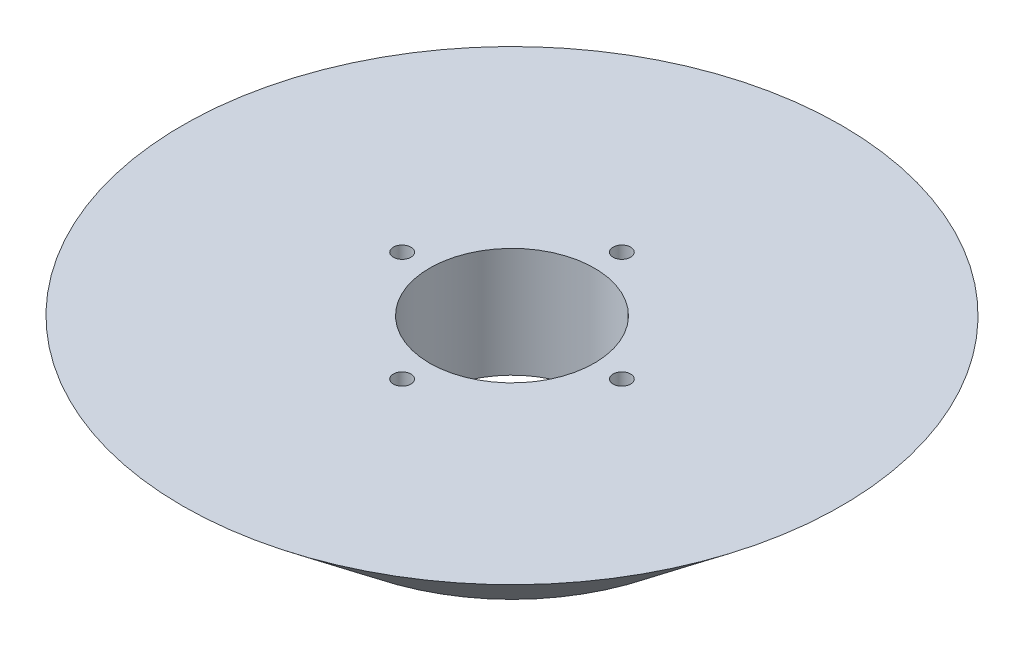
ISO-10303-21;
HEADER;
FILE_DESCRIPTION(('STEP AP214'),'2;1');
FILE_NAME('part.step','',(''),(''),'','','');
FILE_SCHEMA(('AUTOMOTIVE_DESIGN { 1 0 10303 214 1 1 1 1 }'));
ENDSEC;
DATA;
#1=APPLICATION_CONTEXT('core data for automotive mechanical design processes');
#2=APPLICATION_PROTOCOL_DEFINITION('international standard','automotive_design',2000,#1);
#3=PRODUCT_CONTEXT('',#1,'mechanical');
#4=PRODUCT('Part','Part','',(#3));
#5=PRODUCT_RELATED_PRODUCT_CATEGORY('part','',(#4));
#6=PRODUCT_DEFINITION_FORMATION('','',#4);
#7=PRODUCT_DEFINITION_CONTEXT('part definition',#1,'design');
#8=PRODUCT_DEFINITION('design','',#6,#7);
#9=PRODUCT_DEFINITION_SHAPE('','',#8);
#10=(LENGTH_UNIT() NAMED_UNIT(*) SI_UNIT(.MILLI.,.METRE.));
#11=(NAMED_UNIT(*) PLANE_ANGLE_UNIT() SI_UNIT($,.RADIAN.));
#12=(NAMED_UNIT(*) SI_UNIT($,.STERADIAN.) SOLID_ANGLE_UNIT());
#13=UNCERTAINTY_MEASURE_WITH_UNIT(LENGTH_MEASURE(1.E-05),#10,'distance_accuracy_value','');
#14=(GEOMETRIC_REPRESENTATION_CONTEXT(3) GLOBAL_UNCERTAINTY_ASSIGNED_CONTEXT((#13)) GLOBAL_UNIT_ASSIGNED_CONTEXT((#10,
#11,#12)) REPRESENTATION_CONTEXT('',''));
#15=CARTESIAN_POINT('',(0.,0.,0.));
#16=DIRECTION('',(0.,0.,1.));
#17=DIRECTION('',(1.,0.,0.));
#18=AXIS2_PLACEMENT_3D('',#15,#16,#17);
#19=CARTESIAN_POINT('',(0.,0.,0.));
#20=DIRECTION('',(0.,1.,0.));
#21=DIRECTION('',(0.,0.,1.));
#22=AXIS2_PLACEMENT_3D('',#19,#20,#21);
#23=PLANE('',#22);
#24=CARTESIAN_POINT('',(0.,0.,-20.));
#25=DIRECTION('',(0.,1.,0.));
#26=DIRECTION('',(0.,0.,1.));
#27=AXIS2_PLACEMENT_3D('',#24,#25,#26);
#28=CIRCLE('',#27,1.6);
#29=CARTESIAN_POINT('',(0.,0.,-18.4));
#30=VERTEX_POINT('',#29);
#31=EDGE_CURVE('E46',#30,#30,#28,.T.);
#32=ORIENTED_EDGE('',*,*,#31,.T.);
#33=EDGE_LOOP('',(#32));
#34=FACE_BOUND('',#33,.T.);
#35=CARTESIAN_POINT('',(-20.,0.,0.));
#36=DIRECTION('',(0.,1.,0.));
#37=DIRECTION('',(0.,0.,1.));
#38=AXIS2_PLACEMENT_3D('',#35,#36,#37);
#39=CIRCLE('',#38,1.6000000000002);
#40=CARTESIAN_POINT('',(-20.,0.,1.6000000000002));
#41=VERTEX_POINT('',#40);
#42=EDGE_CURVE('E104',#41,#41,#39,.T.);
#43=ORIENTED_EDGE('',*,*,#42,.T.);
#44=EDGE_LOOP('',(#43));
#45=FACE_BOUND('',#44,.T.);
#46=CARTESIAN_POINT('',(0.,0.,20.));
#47=DIRECTION('',(0.,1.,0.));
#48=DIRECTION('',(0.,0.,1.));
#49=AXIS2_PLACEMENT_3D('',#46,#47,#48);
#50=CIRCLE('',#49,1.60000000000013);
#51=CARTESIAN_POINT('',(0.,0.,21.6000000000001));
#52=VERTEX_POINT('',#51);
#53=EDGE_CURVE('E107',#52,#52,#50,.T.);
#54=ORIENTED_EDGE('',*,*,#53,.T.);
#55=EDGE_LOOP('',(#54));
#56=FACE_BOUND('',#55,.T.);
#57=CARTESIAN_POINT('',(20.,0.,0.));
#58=DIRECTION('',(0.,1.,0.));
#59=DIRECTION('',(0.,0.,1.));
#60=AXIS2_PLACEMENT_3D('',#57,#58,#59);
#61=CIRCLE('',#60,1.60000000000007);
#62=CARTESIAN_POINT('',(20.,0.,1.60000000000007));
#63=VERTEX_POINT('',#62);
#64=EDGE_CURVE('E110',#63,#63,#61,.T.);
#65=ORIENTED_EDGE('',*,*,#64,.T.);
#66=EDGE_LOOP('',(#65));
#67=FACE_BOUND('',#66,.T.);
#68=CARTESIAN_POINT('',(0.,0.,0.));
#69=DIRECTION('',(0.,1.,0.));
#70=DIRECTION('',(0.,0.,1.));
#71=AXIS2_PLACEMENT_3D('',#68,#69,#70);
#72=CIRCLE('',#71,15.);
#73=CARTESIAN_POINT('',(0.,0.,15.));
#74=VERTEX_POINT('',#73);
#75=EDGE_CURVE('E113',#74,#74,#72,.T.);
#76=ORIENTED_EDGE('',*,*,#75,.T.);
#77=EDGE_LOOP('',(#76));
#78=FACE_BOUND('',#77,.T.);
#79=CARTESIAN_POINT('',(0.,0.,0.));
#80=DIRECTION('',(0.,1.,0.));
#81=DIRECTION('',(0.,0.,1.));
#82=AXIS2_PLACEMENT_3D('',#79,#80,#81);
#83=CIRCLE('',#82,35.);
#84=CARTESIAN_POINT('',(0.,0.,35.));
#85=VERTEX_POINT('',#84);
#86=EDGE_CURVE('E11',#85,#85,#83,.T.);
#87=ORIENTED_EDGE('',*,*,#86,.F.);
#88=EDGE_LOOP('',(#87));
#89=FACE_BOUND('',#88,.T.);
#90=ADVANCED_FACE('F33',(#34,#45,#56,#67,#78,#89),#23,.F.);
#91=CARTESIAN_POINT('',(0.,20.,0.));
#92=DIRECTION('',(0.,1.,0.));
#93=DIRECTION('',(0.,0.,1.));
#94=AXIS2_PLACEMENT_3D('',#91,#92,#93);
#95=PLANE('',#94);
#96=CARTESIAN_POINT('',(0.,20.,-20.));
#97=DIRECTION('',(0.,1.,0.));
#98=DIRECTION('',(0.,0.,1.));
#99=AXIS2_PLACEMENT_3D('',#96,#97,#98);
#100=CIRCLE('',#99,1.6);
#101=CARTESIAN_POINT('',(0.,20.,-18.4));
#102=VERTEX_POINT('',#101);
#103=EDGE_CURVE('E116',#102,#102,#100,.T.);
#104=ORIENTED_EDGE('',*,*,#103,.F.);
#105=EDGE_LOOP('',(#104));
#106=FACE_BOUND('',#105,.T.);
#107=CARTESIAN_POINT('',(-20.,20.,0.));
#108=DIRECTION('',(0.,1.,0.));
#109=DIRECTION('',(0.,0.,1.));
#110=AXIS2_PLACEMENT_3D('',#107,#108,#109);
#111=CIRCLE('',#110,1.6000000000002);
#112=CARTESIAN_POINT('',(-20.,20.,1.6000000000002));
#113=VERTEX_POINT('',#112);
#114=EDGE_CURVE('E124',#113,#113,#111,.T.);
#115=ORIENTED_EDGE('',*,*,#114,.F.);
#116=EDGE_LOOP('',(#115));
#117=FACE_BOUND('',#116,.T.);
#118=CARTESIAN_POINT('',(0.,20.,20.));
#119=DIRECTION('',(0.,1.,0.));
#120=DIRECTION('',(0.,0.,1.));
#121=AXIS2_PLACEMENT_3D('',#118,#119,#120);
#122=CIRCLE('',#121,1.60000000000013);
#123=CARTESIAN_POINT('',(0.,20.,21.6000000000001));
#124=VERTEX_POINT('',#123);
#125=EDGE_CURVE('E121',#124,#124,#122,.T.);
#126=ORIENTED_EDGE('',*,*,#125,.F.);
#127=EDGE_LOOP('',(#126));
#128=FACE_BOUND('',#127,.T.);
#129=CARTESIAN_POINT('',(20.,20.,0.));
#130=DIRECTION('',(0.,1.,0.));
#131=DIRECTION('',(0.,0.,1.));
#132=AXIS2_PLACEMENT_3D('',#129,#130,#131);
#133=CIRCLE('',#132,1.60000000000007);
#134=CARTESIAN_POINT('',(20.,20.,1.60000000000007));
#135=VERTEX_POINT('',#134);
#136=EDGE_CURVE('E117',#135,#135,#133,.T.);
#137=ORIENTED_EDGE('',*,*,#136,.F.);
#138=EDGE_LOOP('',(#137));
#139=FACE_BOUND('',#138,.T.);
#140=CARTESIAN_POINT('',(0.,20.,0.));
#141=DIRECTION('',(0.,1.,0.));
#142=DIRECTION('',(0.,0.,1.));
#143=AXIS2_PLACEMENT_3D('',#140,#141,#142);
#144=CIRCLE('',#143,15.);
#145=CARTESIAN_POINT('',(0.,20.,15.));
#146=VERTEX_POINT('',#145);
#147=EDGE_CURVE('E120',#146,#146,#144,.T.);
#148=ORIENTED_EDGE('',*,*,#147,.F.);
#149=EDGE_LOOP('',(#148));
#150=FACE_BOUND('',#149,.T.);
#151=CARTESIAN_POINT('',(0.,20.,0.));
#152=DIRECTION('',(0.,1.,0.));
#153=DIRECTION('',(0.,0.,1.));
#154=AXIS2_PLACEMENT_3D('',#151,#152,#153);
#155=CIRCLE('',#154,60.);
#156=CARTESIAN_POINT('',(0.,20.,60.));
#157=VERTEX_POINT('',#156);
#158=EDGE_CURVE('E41',#157,#157,#155,.T.);
#159=ORIENTED_EDGE('',*,*,#158,.T.);
#160=EDGE_LOOP('',(#159));
#161=FACE_BOUND('',#160,.T.);
#162=ADVANCED_FACE('F66',(#106,#117,#128,#139,#150,#161),#95,.T.);
#163=CARTESIAN_POINT('',(0.,0.,0.));
#164=DIRECTION('',(0.,1.,0.));
#165=DIRECTION('',(0.,0.,1.));
#166=AXIS2_PLACEMENT_3D('',#163,#164,#165);
#167=CONICAL_SURFACE('',#166,35.,0.896055384571344);
#168=ORIENTED_EDGE('',*,*,#158,.F.);
#169=EDGE_LOOP('',(#168));
#170=FACE_BOUND('',#169,.T.);
#171=ORIENTED_EDGE('',*,*,#86,.T.);
#172=EDGE_LOOP('',(#171));
#173=FACE_BOUND('',#172,.T.);
#174=ADVANCED_FACE('F75',(#170,#173),#167,.T.);
#175=CARTESIAN_POINT('',(0.,-9.99999999994061E-05,0.));
#176=DIRECTION('',(0.,1.,0.));
#177=DIRECTION('',(0.,0.,1.));
#178=AXIS2_PLACEMENT_3D('',#175,#176,#177);
#179=CYLINDRICAL_SURFACE('',#178,15.);
#180=ORIENTED_EDGE('',*,*,#147,.T.);
#181=EDGE_LOOP('',(#180));
#182=FACE_BOUND('',#181,.T.);
#183=ORIENTED_EDGE('',*,*,#75,.F.);
#184=EDGE_LOOP('',(#183));
#185=FACE_BOUND('',#184,.T.);
#186=ADVANCED_FACE('F81',(#182,#185),#179,.F.);
#187=CARTESIAN_POINT('',(20.,-9.99999999994061E-05,0.));
#188=DIRECTION('',(0.,1.,0.));
#189=DIRECTION('',(0.,0.,1.));
#190=AXIS2_PLACEMENT_3D('',#187,#188,#189);
#191=CYLINDRICAL_SURFACE('',#190,1.60000000000007);
#192=ORIENTED_EDGE('',*,*,#136,.T.);
#193=EDGE_LOOP('',(#192));
#194=FACE_BOUND('',#193,.T.);
#195=ORIENTED_EDGE('',*,*,#64,.F.);
#196=EDGE_LOOP('',(#195));
#197=FACE_BOUND('',#196,.T.);
#198=ADVANCED_FACE('F77',(#194,#197),#191,.F.);
#199=CARTESIAN_POINT('',(0.,-9.99999999994061E-05,20.));
#200=DIRECTION('',(0.,1.,0.));
#201=DIRECTION('',(0.,0.,1.));
#202=AXIS2_PLACEMENT_3D('',#199,#200,#201);
#203=CYLINDRICAL_SURFACE('',#202,1.60000000000013);
#204=ORIENTED_EDGE('',*,*,#125,.T.);
#205=EDGE_LOOP('',(#204));
#206=FACE_BOUND('',#205,.T.);
#207=ORIENTED_EDGE('',*,*,#53,.F.);
#208=EDGE_LOOP('',(#207));
#209=FACE_BOUND('',#208,.T.);
#210=ADVANCED_FACE('F161',(#206,#209),#203,.F.);
#211=CARTESIAN_POINT('',(-20.,-9.99999999994061E-05,0.));
#212=DIRECTION('',(0.,1.,0.));
#213=DIRECTION('',(0.,0.,1.));
#214=AXIS2_PLACEMENT_3D('',#211,#212,#213);
#215=CYLINDRICAL_SURFACE('',#214,1.6000000000002);
#216=ORIENTED_EDGE('',*,*,#114,.T.);
#217=EDGE_LOOP('',(#216));
#218=FACE_BOUND('',#217,.T.);
#219=ORIENTED_EDGE('',*,*,#42,.F.);
#220=EDGE_LOOP('',(#219));
#221=FACE_BOUND('',#220,.T.);
#222=ADVANCED_FACE('F166',(#218,#221),#215,.F.);
#223=CARTESIAN_POINT('',(0.,-9.99999999994061E-05,-20.));
#224=DIRECTION('',(0.,1.,0.));
#225=DIRECTION('',(0.,0.,1.));
#226=AXIS2_PLACEMENT_3D('',#223,#224,#225);
#227=CYLINDRICAL_SURFACE('',#226,1.6);
#228=ORIENTED_EDGE('',*,*,#103,.T.);
#229=EDGE_LOOP('',(#228));
#230=FACE_BOUND('',#229,.T.);
#231=ORIENTED_EDGE('',*,*,#31,.F.);
#232=EDGE_LOOP('',(#231));
#233=FACE_BOUND('',#232,.T.);
#234=ADVANCED_FACE('F132',(#230,#233),#227,.F.);
#235=CLOSED_SHELL('',(#90,#162,#174,#186,#198,#210,#222,#234));
#236=MANIFOLD_SOLID_BREP('B2',#235);
#237=ADVANCED_BREP_SHAPE_REPRESENTATION('',(#18,#236),#14);
#238=SHAPE_DEFINITION_REPRESENTATION(#9,#237);
ENDSEC;
END-ISO-10303-21;
